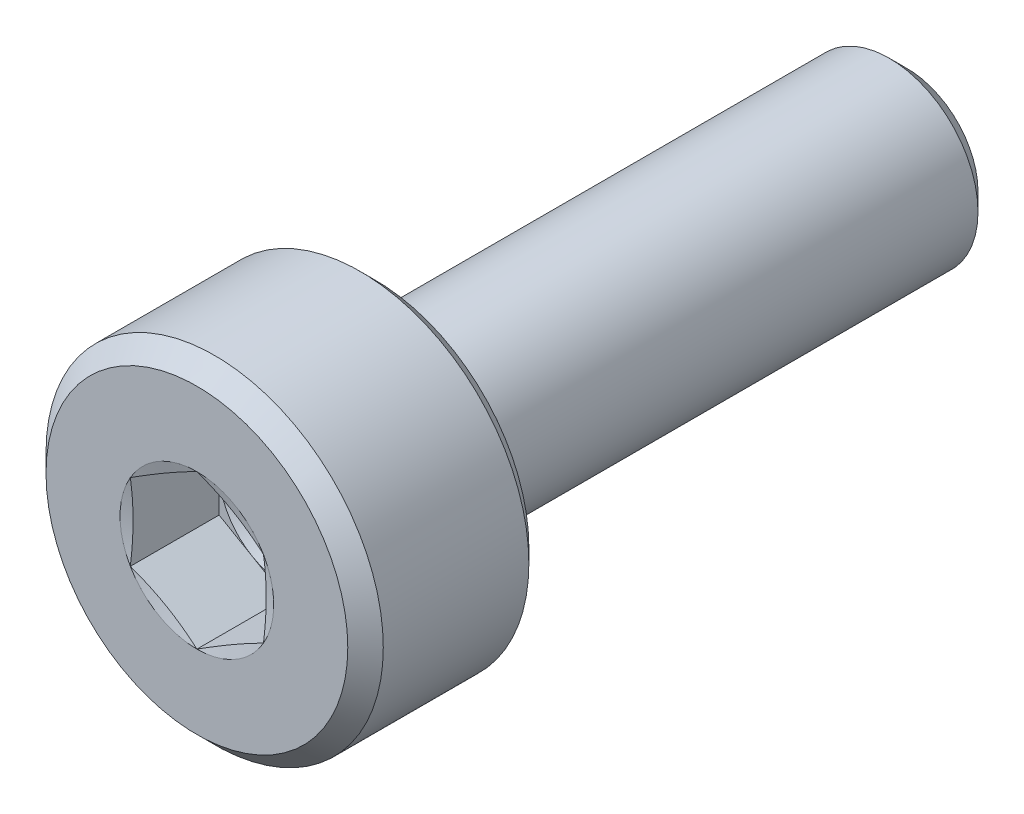
ISO-10303-21;
HEADER;
FILE_DESCRIPTION(('STEP AP214'),'2;1');
FILE_NAME('part.step','',(''),(''),'','','');
FILE_SCHEMA(('AUTOMOTIVE_DESIGN { 1 0 10303 214 1 1 1 1 }'));
ENDSEC;
DATA;
#1=APPLICATION_CONTEXT('core data for automotive mechanical design processes');
#2=APPLICATION_PROTOCOL_DEFINITION('international standard','automotive_design',2000,#1);
#3=PRODUCT_CONTEXT('',#1,'mechanical');
#4=PRODUCT('Part','Part','',(#3));
#5=PRODUCT_RELATED_PRODUCT_CATEGORY('part','',(#4));
#6=PRODUCT_DEFINITION_FORMATION('','',#4);
#7=PRODUCT_DEFINITION_CONTEXT('part definition',#1,'design');
#8=PRODUCT_DEFINITION('design','',#6,#7);
#9=PRODUCT_DEFINITION_SHAPE('','',#8);
#10=(LENGTH_UNIT() NAMED_UNIT(*) SI_UNIT(.MILLI.,.METRE.));
#11=(NAMED_UNIT(*) PLANE_ANGLE_UNIT() SI_UNIT($,.RADIAN.));
#12=(NAMED_UNIT(*) SI_UNIT($,.STERADIAN.) SOLID_ANGLE_UNIT());
#13=UNCERTAINTY_MEASURE_WITH_UNIT(LENGTH_MEASURE(1.E-05),#10,'distance_accuracy_value','');
#14=(GEOMETRIC_REPRESENTATION_CONTEXT(3) GLOBAL_UNCERTAINTY_ASSIGNED_CONTEXT((#13)) GLOBAL_UNIT_ASSIGNED_CONTEXT((#10,
#11,#12)) REPRESENTATION_CONTEXT('',''));
#15=CARTESIAN_POINT('',(0.,0.,0.));
#16=DIRECTION('',(0.,0.,1.));
#17=DIRECTION('',(1.,0.,0.));
#18=AXIS2_PLACEMENT_3D('',#15,#16,#17);
#19=CARTESIAN_POINT('',(0.,0.,0.));
#20=DIRECTION('',(0.,0.,-1.));
#21=DIRECTION('',(-1.,0.,0.));
#22=AXIS2_PLACEMENT_3D('',#19,#20,#21);
#23=PLANE('',#22);
#24=CARTESIAN_POINT('',(0.,0.,0.));
#25=DIRECTION('',(0.,0.,1.));
#26=DIRECTION('',(1.,0.,0.));
#27=AXIS2_PLACEMENT_3D('',#24,#25,#26);
#28=CIRCLE('',#27,1.7);
#29=CARTESIAN_POINT('',(1.7,0.,0.));
#30=VERTEX_POINT('',#29);
#31=EDGE_CURVE('E230',#30,#30,#28,.T.);
#32=ORIENTED_EDGE('',*,*,#31,.T.);
#33=EDGE_LOOP('',(#32));
#34=FACE_BOUND('',#33,.T.);
#35=CARTESIAN_POINT('',(0.,0.,0.));
#36=DIRECTION('',(0.,0.,1.));
#37=DIRECTION('',(1.,0.,0.));
#38=AXIS2_PLACEMENT_3D('',#35,#36,#37);
#39=CIRCLE('',#38,0.866025403784438);
#40=CARTESIAN_POINT('',(-0.75,-0.433012701892219,0.));
#41=VERTEX_POINT('',#40);
#42=CARTESIAN_POINT('',(0.,-0.866025403784438,0.));
#43=VERTEX_POINT('',#42);
#44=EDGE_CURVE('E156',#41,#43,#39,.T.);
#45=ORIENTED_EDGE('',*,*,#44,.F.);
#46=CARTESIAN_POINT('',(-0.75,0.433012701892219,0.));
#47=VERTEX_POINT('',#46);
#48=EDGE_CURVE('E155',#47,#41,#39,.T.);
#49=ORIENTED_EDGE('',*,*,#48,.F.);
#50=CARTESIAN_POINT('',(0.,0.866025403784438,0.));
#51=VERTEX_POINT('',#50);
#52=EDGE_CURVE('E122',#51,#47,#39,.T.);
#53=ORIENTED_EDGE('',*,*,#52,.F.);
#54=CARTESIAN_POINT('',(0.75,0.433012701892219,0.));
#55=VERTEX_POINT('',#54);
#56=EDGE_CURVE('E116',#55,#51,#39,.T.);
#57=ORIENTED_EDGE('',*,*,#56,.F.);
#58=CARTESIAN_POINT('',(0.749999999999999,-0.433012701892221,0.));
#59=VERTEX_POINT('',#58);
#60=EDGE_CURVE('E124',#59,#55,#39,.T.);
#61=ORIENTED_EDGE('',*,*,#60,.F.);
#62=EDGE_CURVE('E314',#43,#59,#39,.T.);
#63=ORIENTED_EDGE('',*,*,#62,.F.);
#64=EDGE_LOOP('',(#45,#49,#53,#57,#61,#63));
#65=FACE_BOUND('',#64,.T.);
#66=ADVANCED_FACE('F39',(#34,#65),#23,.F.);
#67=CARTESIAN_POINT('',(0.,0.,-0.2));
#68=DIRECTION('',(0.,0.,-1.));
#69=DIRECTION('',(-1.,0.,0.));
#70=AXIS2_PLACEMENT_3D('',#67,#68,#69);
#71=CONICAL_SURFACE('',#70,1.9,0.78539816339746);
#72=ORIENTED_EDGE('',*,*,#31,.F.);
#73=EDGE_LOOP('',(#72));
#74=FACE_BOUND('',#73,.T.);
#75=CARTESIAN_POINT('',(0.,0.,-0.2));
#76=DIRECTION('',(0.,0.,1.));
#77=DIRECTION('',(1.,0.,0.));
#78=AXIS2_PLACEMENT_3D('',#75,#76,#77);
#79=CIRCLE('',#78,1.9);
#80=CARTESIAN_POINT('',(1.9,0.,-0.2));
#81=VERTEX_POINT('',#80);
#82=EDGE_CURVE('E232',#81,#81,#79,.T.);
#83=ORIENTED_EDGE('',*,*,#82,.T.);
#84=EDGE_LOOP('',(#83));
#85=FACE_BOUND('',#84,.T.);
#86=ADVANCED_FACE('F221',(#74,#85),#71,.T.);
#87=CARTESIAN_POINT('',(0.,0.,0.));
#88=DIRECTION('',(0.,0.,1.));
#89=DIRECTION('',(1.,0.,0.));
#90=AXIS2_PLACEMENT_3D('',#87,#88,#89);
#91=CYLINDRICAL_SURFACE('',#90,1.9);
#92=ORIENTED_EDGE('',*,*,#82,.F.);
#93=EDGE_LOOP('',(#92));
#94=FACE_BOUND('',#93,.T.);
#95=CARTESIAN_POINT('',(0.,0.,-1.84));
#96=DIRECTION('',(0.,0.,1.));
#97=DIRECTION('',(1.,0.,0.));
#98=AXIS2_PLACEMENT_3D('',#95,#96,#97);
#99=CIRCLE('',#98,1.9);
#100=CARTESIAN_POINT('',(1.9,0.,-1.84));
#101=VERTEX_POINT('',#100);
#102=EDGE_CURVE('E235',#101,#101,#99,.T.);
#103=ORIENTED_EDGE('',*,*,#102,.T.);
#104=EDGE_LOOP('',(#103));
#105=FACE_BOUND('',#104,.T.);
#106=ADVANCED_FACE('F226',(#94,#105),#91,.T.);
#107=CARTESIAN_POINT('',(0.,0.,-2.));
#108=DIRECTION('',(0.,0.,1.));
#109=DIRECTION('',(1.,0.,0.));
#110=AXIS2_PLACEMENT_3D('',#107,#108,#109);
#111=CONICAL_SURFACE('',#110,1.74,0.785398163397452);
#112=ORIENTED_EDGE('',*,*,#102,.F.);
#113=EDGE_LOOP('',(#112));
#114=FACE_BOUND('',#113,.T.);
#115=CARTESIAN_POINT('',(0.,0.,-2.));
#116=DIRECTION('',(0.,0.,1.));
#117=DIRECTION('',(1.,0.,0.));
#118=AXIS2_PLACEMENT_3D('',#115,#116,#117);
#119=CIRCLE('',#118,1.74);
#120=CARTESIAN_POINT('',(1.74,0.,-2.));
#121=VERTEX_POINT('',#120);
#122=EDGE_CURVE('E240',#121,#121,#119,.T.);
#123=ORIENTED_EDGE('',*,*,#122,.T.);
#124=EDGE_LOOP('',(#123));
#125=FACE_BOUND('',#124,.T.);
#126=ADVANCED_FACE('F430',(#114,#125),#111,.T.);
#127=CARTESIAN_POINT('',(0.,1.74,-2.));
#128=DIRECTION('',(0.,0.,1.));
#129=DIRECTION('',(1.,0.,0.));
#130=AXIS2_PLACEMENT_3D('',#127,#128,#129);
#131=PLANE('',#130);
#132=ORIENTED_EDGE('',*,*,#122,.F.);
#133=EDGE_LOOP('',(#132));
#134=FACE_BOUND('',#133,.T.);
#135=CARTESIAN_POINT('',(0.,0.,-2.));
#136=DIRECTION('',(0.,0.,1.));
#137=DIRECTION('',(1.,0.,0.));
#138=AXIS2_PLACEMENT_3D('',#135,#136,#137);
#139=CIRCLE('',#138,1.3);
#140=CARTESIAN_POINT('',(1.3,0.,-2.));
#141=VERTEX_POINT('',#140);
#142=EDGE_CURVE('E243',#141,#141,#139,.T.);
#143=ORIENTED_EDGE('',*,*,#142,.T.);
#144=EDGE_LOOP('',(#143));
#145=FACE_BOUND('',#144,.T.);
#146=ADVANCED_FACE('F422',(#134,#145),#131,.F.);
#147=CARTESIAN_POINT('',(0.,0.,-2.1));
#148=DIRECTION('',(0.,0.,1.));
#149=DIRECTION('',(1.,0.,0.));
#150=AXIS2_PLACEMENT_3D('',#147,#148,#149);
#151=TOROIDAL_SURFACE('',#150,1.3,0.1);
#152=ORIENTED_EDGE('',*,*,#142,.F.);
#153=EDGE_LOOP('',(#152));
#154=FACE_BOUND('',#153,.T.);
#155=CARTESIAN_POINT('',(0.,0.,-2.05615763679786));
#156=DIRECTION('',(0.,0.,1.));
#157=DIRECTION('',(1.,0.,0.));
#158=AXIS2_PLACEMENT_3D('',#155,#156,#157);
#159=CIRCLE('',#158,1.21012315543561);
#160=CARTESIAN_POINT('',(1.21012315543561,0.,-2.05615763679786));
#161=VERTEX_POINT('',#160);
#162=EDGE_CURVE('E246',#161,#161,#159,.T.);
#163=ORIENTED_EDGE('',*,*,#162,.T.);
#164=EDGE_LOOP('',(#163));
#165=FACE_BOUND('',#164,.T.);
#166=ADVANCED_FACE('F414',(#154,#165),#151,.F.);
#167=CARTESIAN_POINT('',(0.,0.,-2.46615763679786));
#168=DIRECTION('',(0.,0.,1.));
#169=DIRECTION('',(1.,0.,0.));
#170=AXIS2_PLACEMENT_3D('',#167,#168,#169);
#171=CONICAL_SURFACE('',#170,1.01012315543561,0.453844001521509);
#172=ORIENTED_EDGE('',*,*,#162,.F.);
#173=EDGE_LOOP('',(#172));
#174=FACE_BOUND('',#173,.T.);
#175=CARTESIAN_POINT('',(0.,0.,-2.46615763679786));
#176=DIRECTION('',(0.,0.,1.));
#177=DIRECTION('',(1.,0.,0.));
#178=AXIS2_PLACEMENT_3D('',#175,#176,#177);
#179=CIRCLE('',#178,1.01012315543561);
#180=CARTESIAN_POINT('',(1.01012315543561,0.,-2.46615763679786));
#181=VERTEX_POINT('',#180);
#182=EDGE_CURVE('E249',#181,#181,#179,.T.);
#183=ORIENTED_EDGE('',*,*,#182,.T.);
#184=EDGE_LOOP('',(#183));
#185=FACE_BOUND('',#184,.T.);
#186=ADVANCED_FACE('F406',(#174,#185),#171,.T.);
#187=CARTESIAN_POINT('',(0.,0.,-2.51));
#188=DIRECTION('',(0.,0.,1.));
#189=DIRECTION('',(1.,0.,0.));
#190=AXIS2_PLACEMENT_3D('',#187,#188,#189);
#191=TOROIDAL_SURFACE('',#190,1.1,0.0999999999999999);
#192=ORIENTED_EDGE('',*,*,#182,.F.);
#193=EDGE_LOOP('',(#192));
#194=FACE_BOUND('',#193,.T.);
#195=CARTESIAN_POINT('',(0.,0.,-2.51));
#196=DIRECTION('',(0.,0.,1.));
#197=DIRECTION('',(1.,0.,0.));
#198=AXIS2_PLACEMENT_3D('',#195,#196,#197);
#199=CIRCLE('',#198,1.);
#200=CARTESIAN_POINT('',(1.,0.,-2.51));
#201=VERTEX_POINT('',#200);
#202=EDGE_CURVE('E252',#201,#201,#199,.T.);
#203=ORIENTED_EDGE('',*,*,#202,.T.);
#204=EDGE_LOOP('',(#203));
#205=FACE_BOUND('',#204,.T.);
#206=ADVANCED_FACE('F398',(#194,#205),#191,.F.);
#207=CARTESIAN_POINT('',(0.,0.,0.));
#208=DIRECTION('',(0.,0.,1.));
#209=DIRECTION('',(1.,0.,0.));
#210=AXIS2_PLACEMENT_3D('',#207,#208,#209);
#211=CYLINDRICAL_SURFACE('',#210,1.);
#212=ORIENTED_EDGE('',*,*,#202,.F.);
#213=EDGE_LOOP('',(#212));
#214=FACE_BOUND('',#213,.T.);
#215=CARTESIAN_POINT('',(0.,0.,-7.79999999999999));
#216=DIRECTION('',(0.,0.,1.));
#217=DIRECTION('',(1.,0.,0.));
#218=AXIS2_PLACEMENT_3D('',#215,#216,#217);
#219=CIRCLE('',#218,1.);
#220=CARTESIAN_POINT('',(1.,0.,-7.79999999999999));
#221=VERTEX_POINT('',#220);
#222=EDGE_CURVE('E255',#221,#221,#219,.T.);
#223=ORIENTED_EDGE('',*,*,#222,.T.);
#224=EDGE_LOOP('',(#223));
#225=FACE_BOUND('',#224,.T.);
#226=ADVANCED_FACE('F389',(#214,#225),#211,.T.);
#227=CARTESIAN_POINT('',(0.,0.,-8.));
#228=DIRECTION('',(0.,0.,1.));
#229=DIRECTION('',(1.,0.,0.));
#230=AXIS2_PLACEMENT_3D('',#227,#228,#229);
#231=CONICAL_SURFACE('',#230,0.8,0.785398163397432);
#232=ORIENTED_EDGE('',*,*,#222,.F.);
#233=EDGE_LOOP('',(#232));
#234=FACE_BOUND('',#233,.T.);
#235=CARTESIAN_POINT('',(0.,0.,-8.));
#236=DIRECTION('',(0.,0.,1.));
#237=DIRECTION('',(1.,0.,0.));
#238=AXIS2_PLACEMENT_3D('',#235,#236,#237);
#239=CIRCLE('',#238,0.8);
#240=CARTESIAN_POINT('',(0.8,0.,-8.));
#241=VERTEX_POINT('',#240);
#242=EDGE_CURVE('E258',#241,#241,#239,.T.);
#243=ORIENTED_EDGE('',*,*,#242,.T.);
#244=EDGE_LOOP('',(#243));
#245=FACE_BOUND('',#244,.T.);
#246=ADVANCED_FACE('F381',(#234,#245),#231,.T.);
#247=CARTESIAN_POINT('',(0.,0.8,-8.));
#248=DIRECTION('',(0.,0.,1.));
#249=DIRECTION('',(1.,0.,0.));
#250=AXIS2_PLACEMENT_3D('',#247,#248,#249);
#251=PLANE('',#250);
#252=ORIENTED_EDGE('',*,*,#242,.F.);
#253=EDGE_LOOP('',(#252));
#254=FACE_BOUND('',#253,.T.);
#255=ADVANCED_FACE('F375',(#254),#251,.F.);
#256=CARTESIAN_POINT('',(0.,0.,-0.0310889132455344));
#257=DIRECTION('',(0.,0.,1.));
#258=DIRECTION('',(1.,0.,0.));
#259=AXIS2_PLACEMENT_3D('',#256,#257,#258);
#260=CONICAL_SURFACE('',#259,0.75,1.30899693899575);
#261=ORIENTED_EDGE('',*,*,#52,.T.);
#262=CARTESIAN_POINT('',(-0.7502,0.432897231838381,3.09462948723988E-05));
#263=CARTESIAN_POINT('',(-0.719037840271989,0.450888713145879,-0.00479360311149042));
#264=CARTESIAN_POINT('',(-0.687819151238554,0.468912831663079,-0.00917362250903629));
#265=CARTESIAN_POINT('',(-0.625271438524168,0.505024770435926,-0.0168690566741957));
#266=CARTESIAN_POINT('',(-0.593942375178671,0.523112613591908,-0.0201840383063053));
#267=CARTESIAN_POINT('',(-0.53136401188606,0.559242248484343,-0.0255557361470388));
#268=CARTESIAN_POINT('',(-0.5001151357921,0.577283795509063,-0.0276188631563584));
#269=CARTESIAN_POINT('',(-0.437577500528089,0.613389916063223,-0.0303853199406949));
#270=CARTESIAN_POINT('',(-0.406288750264044,0.631454484450776,-0.0310889132455344));
#271=CARTESIAN_POINT('',(-0.343711249735956,0.667583621225882,-0.0310889132455345));
#272=CARTESIAN_POINT('',(-0.312422499471911,0.685648189613435,-0.0303853199406949));
#273=CARTESIAN_POINT('',(-0.2498848642079,0.721754310167594,-0.0276188631563584));
#274=CARTESIAN_POINT('',(-0.21863598811394,0.739795857192315,-0.0255557361470388));
#275=CARTESIAN_POINT('',(-0.156057624821329,0.77592549208475,-0.0201840383063053));
#276=CARTESIAN_POINT('',(-0.124728561475832,0.794013335240732,-0.0168690566741957));
#277=CARTESIAN_POINT('',(-0.0621808487614457,0.830125274013578,-0.00917362250903634));
#278=CARTESIAN_POINT('',(-0.0309621597280112,0.848149392530779,-0.00479360311149048));
#279=CARTESIAN_POINT('',(0.000200000000000003,0.866140873838276,3.09462948723373E-05));
#280=B_SPLINE_CURVE_WITH_KNOTS('',3,(#262,#263,#264,#265,#266,#267,#268,#269,#270,#271,#272,
#273,#274,#275,#276,#277,#278,#279),.UNSPECIFIED.,.F.,.F.,(4,2,2,2,2,2,2,2,4),(0.,
0.108920587259311,0.217885415043552,0.326287413293608,0.434668396966266,0.543049380638924,
0.651451378888981,0.760416206673221,0.869336793932533),.UNSPECIFIED.);
#281=EDGE_CURVE('E11',#47,#51,#280,.T.);
#282=ORIENTED_EDGE('',*,*,#281,.T.);
#283=EDGE_LOOP('',(#261,#282));
#284=FACE_BOUND('',#283,.T.);
#285=ADVANCED_FACE('F128',(#284),#260,.F.);
#286=CARTESIAN_POINT('',(-0.75,-1.14482258623613,0.13466962524668));
#287=CARTESIAN_POINT('',(-0.75,-1.07678185164575,0.11946091693451));
#288=CARTESIAN_POINT('',(-0.75,-1.00866186993933,0.104564139677019));
#289=CARTESIAN_POINT('',(-0.75,-0.872108780270127,0.0759343556155123));
#290=CARTESIAN_POINT('',(-0.75,-0.803675428468904,0.0622025196192108));
#291=CARTESIAN_POINT('',(-0.75,-0.667024328389678,0.0365778066728533));
#292=CARTESIAN_POINT('',(-0.75,-0.598809231475784,0.0246711034130511));
#293=CARTESIAN_POINT('',(-0.75,-0.461968565078349,0.00349957725576435));
#294=CARTESIAN_POINT('',(-0.75,-0.393343069174551,-0.00576570552870658));
#295=CARTESIAN_POINT('',(-0.75,-0.254874387193197,-0.0204880637590047));
#296=CARTESIAN_POINT('',(-0.75,-0.185026204144043,-0.0259009217168571));
#297=CARTESIAN_POINT('',(-0.75,-0.0451386456006473,-0.0315728233282039));
#298=CARTESIAN_POINT('',(-0.75,0.0249006157145767,-0.0318344646143007));
#299=CARTESIAN_POINT('',(-0.75,0.165046593870639,-0.0271336726580643));
#300=CARTESIAN_POINT('',(-0.75,0.235152611190908,-0.0221520199445757));
#301=CARTESIAN_POINT('',(-0.75,0.374971381665316,-0.00804964390688157));
#302=CARTESIAN_POINT('',(-0.75,0.444683810838038,0.00107409444110482));
#303=CARTESIAN_POINT('',(-0.75,0.57900664470664,0.0214252947723859));
#304=CARTESIAN_POINT('',(-0.75,0.643645711070564,0.0324706666633663));
#305=CARTESIAN_POINT('',(-0.75,0.772626203639037,0.0561976243366958));
#306=CARTESIAN_POINT('',(-0.75,0.836967591207445,0.0688794166647536));
#307=CARTESIAN_POINT('',(-0.75,0.96543538187879,0.0953387697110077));
#308=CARTESIAN_POINT('',(-0.75,1.02956173962238,0.109116548118427));
#309=CARTESIAN_POINT('',(-0.75,1.15764916486959,0.137422879220211));
#310=CARTESIAN_POINT('',(-0.75,1.22161022807931,0.151951451216337));
#311=CARTESIAN_POINT('',(-0.75,1.41205284321497,0.196019971996214));
#312=CARTESIAN_POINT('',(-0.75,1.53835925197156,0.226314183405895));
#313=CARTESIAN_POINT('',(-0.75,1.72754301618681,0.272539035787117));
#314=CARTESIAN_POINT('',(-0.75,1.79052001268668,0.28806821024875));
#315=CARTESIAN_POINT('',(-0.75,1.91641912521064,0.319338785610066));
#316=CARTESIAN_POINT('',(-0.75,1.97934124297332,0.335080179505711));
#317=CARTESIAN_POINT('',(-0.75,2.04224365999308,0.350900921516616));
#318=B_SPLINE_CURVE_WITH_KNOTS('',3,(#286,#287,#288,#289,#290,#291,#292,#293,#294,#295,#296,
#297,#298,#299,#300,#301,#302,#303,#304,#305,#306,#307,#308,#309,#310,#311,#312,#313,#314,#315,
#316,#317),.UNSPECIFIED.,.F.,.F.,(4,2,2,2,2,2,2,2,2,2,2,2,2,2,2,4),(0.,0.209172832960231,
0.418553461255022,0.626259888239563,0.833930130186138,1.04394713172849,1.25385822411851,
1.46454144122955,1.67537826112991,1.87207734374703,2.06880127765738,2.26556438371338,
2.46233255076827,2.85198678875997,3.04657695287832,3.24116071043612),.UNSPECIFIED.);
#319=EDGE_CURVE('E121',#41,#47,#318,.T.);
#320=ORIENTED_EDGE('',*,*,#319,.T.);
#321=ORIENTED_EDGE('',*,*,#48,.T.);
#322=EDGE_LOOP('',(#320,#321));
#323=FACE_BOUND('',#322,.T.);
#324=ADVANCED_FACE('F362',(#323),#260,.F.);
#325=CARTESIAN_POINT('',(0.000199999999999821,-0.866140873838277,3.0946294872561E-05));
#326=CARTESIAN_POINT('',(-0.0309621597280112,-0.84814939253078,-0.00479360311149026));
#327=CARTESIAN_POINT('',(-0.0621808487614458,-0.830125274013579,-0.00917362250903614));
#328=CARTESIAN_POINT('',(-0.124728561475833,-0.794013335240732,-0.0168690566741955));
#329=CARTESIAN_POINT('',(-0.15605762482133,-0.775925492084751,-0.0201840383063051));
#330=CARTESIAN_POINT('',(-0.218635988113941,-0.739795857192316,-0.0255557361470386));
#331=CARTESIAN_POINT('',(-0.2498848642079,-0.721754310167595,-0.0276188631563583));
#332=CARTESIAN_POINT('',(-0.312422499471911,-0.685648189613436,-0.0303853199406947));
#333=CARTESIAN_POINT('',(-0.343711249735956,-0.667583621225883,-0.0310889132455343));
#334=CARTESIAN_POINT('',(-0.406288750264045,-0.631454484450776,-0.0310889132455343));
#335=CARTESIAN_POINT('',(-0.437577500528089,-0.613389916063223,-0.0303853199406947));
#336=CARTESIAN_POINT('',(-0.5001151357921,-0.577283795509064,-0.0276188631563583));
#337=CARTESIAN_POINT('',(-0.53136401188606,-0.559242248484343,-0.0255557361470387));
#338=CARTESIAN_POINT('',(-0.593942375178671,-0.523112613591908,-0.0201840383063052));
#339=CARTESIAN_POINT('',(-0.625271438524168,-0.505024770435926,-0.0168690566741956));
#340=CARTESIAN_POINT('',(-0.687819151238555,-0.46891283166308,-0.0091736225090362));
#341=CARTESIAN_POINT('',(-0.719037840271989,-0.450888713145879,-0.00479360311149033));
#342=CARTESIAN_POINT('',(-0.7502,-0.432897231838382,3.09462948724902E-05));
#343=B_SPLINE_CURVE_WITH_KNOTS('',3,(#325,#326,#327,#328,#329,#330,#331,#332,#333,#334,#335,
#336,#337,#338,#339,#340,#341,#342),.UNSPECIFIED.,.F.,.F.,(4,2,2,2,2,2,2,2,4),(0.,
0.108920587259312,0.217885415043552,0.326287413293608,0.434668396966266,0.543049380638925,
0.651451378888981,0.760416206673221,0.869336793932533),.UNSPECIFIED.);
#344=EDGE_CURVE('E164',#43,#41,#343,.T.);
#345=ORIENTED_EDGE('',*,*,#344,.T.);
#346=ORIENTED_EDGE('',*,*,#44,.T.);
#347=EDGE_LOOP('',(#345,#346));
#348=FACE_BOUND('',#347,.T.);
#349=ADVANCED_FACE('F356',(#348),#260,.F.);
#350=CARTESIAN_POINT('',(0.7502,-0.432897231838382,3.0946294872516E-05));
#351=CARTESIAN_POINT('',(0.719037840271989,-0.45088871314588,-0.00479360311149026));
#352=CARTESIAN_POINT('',(0.687819151238554,-0.46891283166308,-0.00917362250903614));
#353=CARTESIAN_POINT('',(0.625271438524167,-0.505024770435927,-0.0168690566741955));
#354=CARTESIAN_POINT('',(0.59394237517867,-0.523112613591908,-0.0201840383063052));
#355=CARTESIAN_POINT('',(0.531364011886059,-0.559242248484343,-0.0255557361470386));
#356=CARTESIAN_POINT('',(0.5001151357921,-0.577283795509064,-0.0276188631563582));
#357=CARTESIAN_POINT('',(0.437577500528089,-0.613389916063224,-0.0303853199406947));
#358=CARTESIAN_POINT('',(0.406288750264044,-0.631454484450777,-0.0310889132455343));
#359=CARTESIAN_POINT('',(0.343711249735955,-0.667583621225883,-0.0310889132455343));
#360=CARTESIAN_POINT('',(0.312422499471911,-0.685648189613436,-0.0303853199406947));
#361=CARTESIAN_POINT('',(0.2498848642079,-0.721754310167595,-0.0276188631563582));
#362=CARTESIAN_POINT('',(0.21863598811394,-0.739795857192316,-0.0255557361470386));
#363=CARTESIAN_POINT('',(0.156057624821329,-0.775925492084751,-0.0201840383063051));
#364=CARTESIAN_POINT('',(0.124728561475832,-0.794013335240733,-0.0168690566741955));
#365=CARTESIAN_POINT('',(0.0621808487614455,-0.830125274013579,-0.00917362250903611));
#366=CARTESIAN_POINT('',(0.0309621597280109,-0.84814939253078,-0.00479360311149025));
#367=CARTESIAN_POINT('',(-0.000200000000000211,-0.866140873838277,3.09462948725669E-05));
#368=B_SPLINE_CURVE_WITH_KNOTS('',3,(#350,#351,#352,#353,#354,#355,#356,#357,#358,#359,#360,
#361,#362,#363,#364,#365,#366,#367),.UNSPECIFIED.,.F.,.F.,(4,2,2,2,2,2,2,2,4),(0.,
0.108920587259312,0.217885415043551,0.326287413293608,0.434668396966266,0.543049380638924,
0.651451378888981,0.760416206673221,0.869336793932533),.UNSPECIFIED.);
#369=EDGE_CURVE('E184',#59,#43,#368,.T.);
#370=ORIENTED_EDGE('',*,*,#369,.T.);
#371=ORIENTED_EDGE('',*,*,#62,.T.);
#372=EDGE_LOOP('',(#370,#371));
#373=FACE_BOUND('',#372,.T.);
#374=ADVANCED_FACE('F350',(#373),#260,.F.);
#375=CARTESIAN_POINT('',(0.75,-1.14482258623613,0.13466962524668));
#376=CARTESIAN_POINT('',(0.75,-1.07678185164575,0.11946091693451));
#377=CARTESIAN_POINT('',(0.75,-1.00866186993933,0.104564139677019));
#378=CARTESIAN_POINT('',(0.75,-0.872108780270127,0.0759343556155123));
#379=CARTESIAN_POINT('',(0.75,-0.803675428468904,0.0622025196192108));
#380=CARTESIAN_POINT('',(0.75,-0.667024328389678,0.0365778066728533));
#381=CARTESIAN_POINT('',(0.75,-0.598809231475784,0.0246711034130512));
#382=CARTESIAN_POINT('',(0.75,-0.461968565078349,0.00349957725576444));
#383=CARTESIAN_POINT('',(0.75,-0.393343069174551,-0.00576570552870653));
#384=CARTESIAN_POINT('',(0.75,-0.254874387193197,-0.0204880637590047));
#385=CARTESIAN_POINT('',(0.75,-0.185026204144043,-0.025900921716857));
#386=CARTESIAN_POINT('',(0.75,-0.045138645600648,-0.0315728233282039));
#387=CARTESIAN_POINT('',(0.75,0.0249006157145759,-0.0318344646143007));
#388=CARTESIAN_POINT('',(0.75,0.165046593870639,-0.0271336726580643));
#389=CARTESIAN_POINT('',(0.75,0.235152611190908,-0.0221520199445758));
#390=CARTESIAN_POINT('',(0.75,0.374971381665316,-0.00804964390688162));
#391=CARTESIAN_POINT('',(0.75,0.444683810838037,0.00107409444110477));
#392=CARTESIAN_POINT('',(0.75,0.57900664470664,0.0214252947723859));
#393=CARTESIAN_POINT('',(0.75,0.643645711070564,0.0324706666633663));
#394=CARTESIAN_POINT('',(0.75,0.772626203639037,0.0561976243366958));
#395=CARTESIAN_POINT('',(0.75,0.836967591207445,0.0688794166647536));
#396=CARTESIAN_POINT('',(0.75,0.965435381878789,0.0953387697110076));
#397=CARTESIAN_POINT('',(0.75,1.02956173962238,0.109116548118427));
#398=CARTESIAN_POINT('',(0.75,1.15764916486959,0.137422879220212));
#399=CARTESIAN_POINT('',(0.75,1.22161022807931,0.151951451216337));
#400=CARTESIAN_POINT('',(0.75,1.41205284321498,0.196019971996214));
#401=CARTESIAN_POINT('',(0.75,1.53835925197156,0.226314183405895));
#402=CARTESIAN_POINT('',(0.75,1.72754301618681,0.272539035787117));
#403=CARTESIAN_POINT('',(0.75,1.79052001268668,0.28806821024875));
#404=CARTESIAN_POINT('',(0.75,1.91641912521064,0.319338785610067));
#405=CARTESIAN_POINT('',(0.75,1.97934124297332,0.335080179505711));
#406=CARTESIAN_POINT('',(0.75,2.04224365999308,0.350900921516616));
#407=B_SPLINE_CURVE_WITH_KNOTS('',3,(#375,#376,#377,#378,#379,#380,#381,#382,#383,#384,#385,
#386,#387,#388,#389,#390,#391,#392,#393,#394,#395,#396,#397,#398,#399,#400,#401,#402,#403,#404,
#405,#406),.UNSPECIFIED.,.F.,.F.,(4,2,2,2,2,2,2,2,2,2,2,2,2,2,2,4),(0.,0.209172832960231,
0.418553461255022,0.626259888239563,0.833930130186138,1.04394713172849,1.25385822411851,
1.46454144122955,1.67537826112991,1.87207734374703,2.06880127765738,2.26556438371338,
2.46233255076827,2.85198678875997,3.04657695287832,3.24116071043612),.UNSPECIFIED.);
#408=EDGE_CURVE('E64',#55,#59,#407,.F.);
#409=ORIENTED_EDGE('',*,*,#408,.T.);
#410=ORIENTED_EDGE('',*,*,#60,.T.);
#411=EDGE_LOOP('',(#409,#410));
#412=FACE_BOUND('',#411,.T.);
#413=ADVANCED_FACE('F177',(#412),#260,.F.);
#414=CARTESIAN_POINT('',(-0.000199999999999916,0.866140873838276,3.094629487239E-05));
#415=CARTESIAN_POINT('',(0.0309621597280112,0.848149392530779,-0.00479360311149047));
#416=CARTESIAN_POINT('',(0.0621808487614458,0.830125274013578,-0.00917362250903634));
#417=CARTESIAN_POINT('',(0.124728561475833,0.794013335240732,-0.0168690566741957));
#418=CARTESIAN_POINT('',(0.15605762482133,0.77592549208475,-0.0201840383063053));
#419=CARTESIAN_POINT('',(0.218635988113941,0.739795857192315,-0.0255557361470388));
#420=CARTESIAN_POINT('',(0.2498848642079,0.721754310167594,-0.0276188631563584));
#421=CARTESIAN_POINT('',(0.312422499471911,0.685648189613435,-0.0303853199406949));
#422=CARTESIAN_POINT('',(0.343711249735956,0.667583621225882,-0.0310889132455344));
#423=CARTESIAN_POINT('',(0.406288750264045,0.631454484450776,-0.0310889132455344));
#424=CARTESIAN_POINT('',(0.437577500528089,0.613389916063223,-0.0303853199406949));
#425=CARTESIAN_POINT('',(0.5001151357921,0.577283795509063,-0.0276188631563584));
#426=CARTESIAN_POINT('',(0.53136401188606,0.559242248484342,-0.0255557361470388));
#427=CARTESIAN_POINT('',(0.593942375178671,0.523112613591907,-0.0201840383063053));
#428=CARTESIAN_POINT('',(0.625271438524168,0.505024770435926,-0.0168690566741956));
#429=CARTESIAN_POINT('',(0.687819151238555,0.468912831663079,-0.00917362250903628));
#430=CARTESIAN_POINT('',(0.719037840271989,0.450888713145878,-0.00479360311149041));
#431=CARTESIAN_POINT('',(0.7502,0.432897231838381,3.09462948724049E-05));
#432=B_SPLINE_CURVE_WITH_KNOTS('',3,(#414,#415,#416,#417,#418,#419,#420,#421,#422,#423,#424,
#425,#426,#427,#428,#429,#430,#431),.UNSPECIFIED.,.F.,.F.,(4,2,2,2,2,2,2,2,4),(0.,
0.108920587259312,0.217885415043552,0.326287413293608,0.434668396966266,0.543049380638924,
0.651451378888981,0.760416206673221,0.869336793932533),.UNSPECIFIED.);
#433=EDGE_CURVE('E58',#51,#55,#432,.T.);
#434=ORIENTED_EDGE('',*,*,#433,.T.);
#435=ORIENTED_EDGE('',*,*,#56,.T.);
#436=EDGE_LOOP('',(#434,#435));
#437=FACE_BOUND('',#436,.T.);
#438=ADVANCED_FACE('F117',(#437),#260,.F.);
#439=CARTESIAN_POINT('',(0.,0.,-1.43301270189222));
#440=DIRECTION('',(0.,0.,1.));
#441=DIRECTION('',(1.,0.,0.));
#442=AXIS2_PLACEMENT_3D('',#439,#440,#441);
#443=CONICAL_SURFACE('',#442,0.,1.0471975511966);
#444=CARTESIAN_POINT('',(0.,0.,-1.));
#445=DIRECTION('',(0.,0.,1.));
#446=DIRECTION('',(1.,0.,0.));
#447=AXIS2_PLACEMENT_3D('',#444,#445,#446);
#448=CIRCLE('',#447,0.75);
#449=CARTESIAN_POINT('',(0.75,0.,-1.));
#450=VERTEX_POINT('',#449);
#451=CARTESIAN_POINT('',(0.375,0.649519052838329,-1.));
#452=VERTEX_POINT('',#451);
#453=EDGE_CURVE('E144',#450,#452,#448,.T.);
#454=ORIENTED_EDGE('',*,*,#453,.T.);
#455=CARTESIAN_POINT('',(-0.375,0.649519052838329,-1.));
#456=VERTEX_POINT('',#455);
#457=EDGE_CURVE('E52',#452,#456,#448,.T.);
#458=ORIENTED_EDGE('',*,*,#457,.T.);
#459=CARTESIAN_POINT('',(-0.75,0.,-1.));
#460=VERTEX_POINT('',#459);
#461=EDGE_CURVE('E295',#456,#460,#448,.T.);
#462=ORIENTED_EDGE('',*,*,#461,.T.);
#463=CARTESIAN_POINT('',(-0.375,-0.649519052838329,-1.));
#464=VERTEX_POINT('',#463);
#465=EDGE_CURVE('E297',#460,#464,#448,.T.);
#466=ORIENTED_EDGE('',*,*,#465,.T.);
#467=CARTESIAN_POINT('',(0.375,-0.649519052838329,-1.));
#468=VERTEX_POINT('',#467);
#469=EDGE_CURVE('E233',#464,#468,#448,.T.);
#470=ORIENTED_EDGE('',*,*,#469,.T.);
#471=EDGE_CURVE('E231',#468,#450,#448,.T.);
#472=ORIENTED_EDGE('',*,*,#471,.T.);
#473=EDGE_LOOP('',(#454,#458,#462,#466,#470,#472));
#474=FACE_BOUND('',#473,.T.);
#475=CARTESIAN_POINT('',(0.,0.,-1.43301270189222));
#476=VERTEX_POINT('',#475);
#477=VERTEX_LOOP('',#476);
#478=FACE_BOUND('',#477,.T.);
#479=ADVANCED_FACE('F176',(#474,#478),#443,.F.);
#480=CARTESIAN_POINT('',(0.,0.,-1.));
#481=DIRECTION('',(0.,0.,1.));
#482=DIRECTION('',(1.,0.,0.));
#483=AXIS2_PLACEMENT_3D('',#480,#481,#482);
#484=PLANE('',#483);
#485=ORIENTED_EDGE('',*,*,#453,.F.);
#486=DIRECTION('',(0.,1.,0.));
#487=VECTOR('',#486,1.);
#488=CARTESIAN_POINT('',(0.75,-0.43301270189222,-1.));
#489=LINE('',#488,#487);
#490=CARTESIAN_POINT('',(0.75,0.433012701892219,-1.));
#491=VERTEX_POINT('',#490);
#492=EDGE_CURVE('E274',#450,#491,#489,.T.);
#493=ORIENTED_EDGE('',*,*,#492,.T.);
#494=DIRECTION('',(-0.866025403784439,0.5,0.));
#495=VECTOR('',#494,1.);
#496=CARTESIAN_POINT('',(0.75,0.433012701892219,-1.));
#497=LINE('',#496,#495);
#498=EDGE_CURVE('E289',#491,#452,#497,.T.);
#499=ORIENTED_EDGE('',*,*,#498,.T.);
#500=EDGE_LOOP('',(#485,#493,#499));
#501=FACE_BOUND('',#500,.T.);
#502=ADVANCED_FACE('F319',(#501),#484,.T.);
#503=ORIENTED_EDGE('',*,*,#471,.F.);
#504=DIRECTION('',(0.866025403784439,0.5,0.));
#505=VECTOR('',#504,1.);
#506=CARTESIAN_POINT('',(0.,-0.866025403784439,-1.));
#507=LINE('',#506,#505);
#508=CARTESIAN_POINT('',(0.75,-0.43301270189222,-1.));
#509=VERTEX_POINT('',#508);
#510=EDGE_CURVE('E278',#468,#509,#507,.T.);
#511=ORIENTED_EDGE('',*,*,#510,.T.);
#512=EDGE_CURVE('E151',#509,#450,#489,.T.);
#513=ORIENTED_EDGE('',*,*,#512,.T.);
#514=EDGE_LOOP('',(#503,#511,#513));
#515=FACE_BOUND('',#514,.T.);
#516=ADVANCED_FACE('F207',(#515),#484,.T.);
#517=ORIENTED_EDGE('',*,*,#469,.F.);
#518=DIRECTION('',(0.866025403784438,-0.5,0.));
#519=VECTOR('',#518,1.);
#520=CARTESIAN_POINT('',(-0.75,-0.43301270189222,-1.));
#521=LINE('',#520,#519);
#522=CARTESIAN_POINT('',(0.,-0.866025403784439,-1.));
#523=VERTEX_POINT('',#522);
#524=EDGE_CURVE('E282',#464,#523,#521,.T.);
#525=ORIENTED_EDGE('',*,*,#524,.T.);
#526=EDGE_CURVE('E275',#523,#468,#507,.T.);
#527=ORIENTED_EDGE('',*,*,#526,.T.);
#528=EDGE_LOOP('',(#517,#525,#527));
#529=FACE_BOUND('',#528,.T.);
#530=ADVANCED_FACE('F310',(#529),#484,.T.);
#531=ORIENTED_EDGE('',*,*,#465,.F.);
#532=DIRECTION('',(0.,-1.,0.));
#533=VECTOR('',#532,1.);
#534=CARTESIAN_POINT('',(-0.75,0.433012701892219,-1.));
#535=LINE('',#534,#533);
#536=CARTESIAN_POINT('',(-0.75,-0.43301270189222,-1.));
#537=VERTEX_POINT('',#536);
#538=EDGE_CURVE('E286',#460,#537,#535,.T.);
#539=ORIENTED_EDGE('',*,*,#538,.T.);
#540=EDGE_CURVE('E279',#537,#464,#521,.T.);
#541=ORIENTED_EDGE('',*,*,#540,.T.);
#542=EDGE_LOOP('',(#531,#539,#541));
#543=FACE_BOUND('',#542,.T.);
#544=ADVANCED_FACE('F324',(#543),#484,.T.);
#545=ORIENTED_EDGE('',*,*,#457,.F.);
#546=CARTESIAN_POINT('',(0.,0.866025403784438,-1.));
#547=VERTEX_POINT('',#546);
#548=EDGE_CURVE('E291',#452,#547,#497,.T.);
#549=ORIENTED_EDGE('',*,*,#548,.T.);
#550=DIRECTION('',(-0.866025403784439,-0.5,0.));
#551=VECTOR('',#550,1.);
#552=CARTESIAN_POINT('',(0.,0.866025403784438,-1.));
#553=LINE('',#552,#551);
#554=EDGE_CURVE('E149',#547,#456,#553,.T.);
#555=ORIENTED_EDGE('',*,*,#554,.T.);
#556=EDGE_LOOP('',(#545,#549,#555));
#557=FACE_BOUND('',#556,.T.);
#558=ADVANCED_FACE('F321',(#557),#484,.T.);
#559=ORIENTED_EDGE('',*,*,#461,.F.);
#560=CARTESIAN_POINT('',(-0.75,0.433012701892219,-1.));
#561=VERTEX_POINT('',#560);
#562=EDGE_CURVE('E288',#456,#561,#553,.T.);
#563=ORIENTED_EDGE('',*,*,#562,.T.);
#564=EDGE_CURVE('E283',#561,#460,#535,.T.);
#565=ORIENTED_EDGE('',*,*,#564,.T.);
#566=EDGE_LOOP('',(#559,#563,#565));
#567=FACE_BOUND('',#566,.T.);
#568=ADVANCED_FACE('F323',(#567),#484,.T.);
#569=CARTESIAN_POINT('',(0.,0.866025403784438,-1.));
#570=DIRECTION('',(-0.5,0.866025403784439,0.));
#571=DIRECTION('',(-0.866025403784439,-0.5,0.));
#572=AXIS2_PLACEMENT_3D('',#569,#570,#571);
#573=PLANE('',#572);
#574=ORIENTED_EDGE('',*,*,#281,.F.);
#575=DIRECTION('',(0.,0.,1.));
#576=VECTOR('',#575,1.);
#577=CARTESIAN_POINT('',(-0.75,0.433012701892219,-1.));
#578=LINE('',#577,#576);
#579=EDGE_CURVE('E150',#561,#47,#578,.T.);
#580=ORIENTED_EDGE('',*,*,#579,.F.);
#581=ORIENTED_EDGE('',*,*,#562,.F.);
#582=ORIENTED_EDGE('',*,*,#554,.F.);
#583=DIRECTION('',(0.,0.,1.));
#584=VECTOR('',#583,1.);
#585=CARTESIAN_POINT('',(0.,0.866025403784438,-1.));
#586=LINE('',#585,#584);
#587=EDGE_CURVE('E139',#547,#51,#586,.T.);
#588=ORIENTED_EDGE('',*,*,#587,.T.);
#589=EDGE_LOOP('',(#574,#580,#581,#582,#588));
#590=FACE_BOUND('',#589,.T.);
#591=ADVANCED_FACE('F146',(#590),#573,.F.);
#592=CARTESIAN_POINT('',(-0.75,0.433012701892219,-1.));
#593=DIRECTION('',(-1.,0.,0.));
#594=DIRECTION('',(0.,0.,1.));
#595=AXIS2_PLACEMENT_3D('',#592,#593,#594);
#596=PLANE('',#595);
#597=ORIENTED_EDGE('',*,*,#319,.F.);
#598=DIRECTION('',(0.,0.,1.));
#599=VECTOR('',#598,1.);
#600=CARTESIAN_POINT('',(-0.75,-0.43301270189222,-1.));
#601=LINE('',#600,#599);
#602=EDGE_CURVE('E262',#537,#41,#601,.T.);
#603=ORIENTED_EDGE('',*,*,#602,.F.);
#604=ORIENTED_EDGE('',*,*,#538,.F.);
#605=ORIENTED_EDGE('',*,*,#564,.F.);
#606=ORIENTED_EDGE('',*,*,#579,.T.);
#607=EDGE_LOOP('',(#597,#603,#604,#605,#606));
#608=FACE_BOUND('',#607,.T.);
#609=ADVANCED_FACE('F171',(#608),#596,.F.);
#610=CARTESIAN_POINT('',(-0.75,-0.43301270189222,-1.));
#611=DIRECTION('',(-0.5,-0.866025403784439,0.));
#612=DIRECTION('',(0.866025403784438,-0.5,0.));
#613=AXIS2_PLACEMENT_3D('',#610,#611,#612);
#614=PLANE('',#613);
#615=ORIENTED_EDGE('',*,*,#344,.F.);
#616=DIRECTION('',(0.,0.,1.));
#617=VECTOR('',#616,1.);
#618=CARTESIAN_POINT('',(0.,-0.866025403784439,-1.));
#619=LINE('',#618,#617);
#620=EDGE_CURVE('E265',#523,#43,#619,.T.);
#621=ORIENTED_EDGE('',*,*,#620,.F.);
#622=ORIENTED_EDGE('',*,*,#524,.F.);
#623=ORIENTED_EDGE('',*,*,#540,.F.);
#624=ORIENTED_EDGE('',*,*,#602,.T.);
#625=EDGE_LOOP('',(#615,#621,#622,#623,#624));
#626=FACE_BOUND('',#625,.T.);
#627=ADVANCED_FACE('F210',(#626),#614,.F.);
#628=CARTESIAN_POINT('',(0.,-0.866025403784439,-1.));
#629=DIRECTION('',(0.5,-0.866025403784439,0.));
#630=DIRECTION('',(0.866025403784439,0.5,0.));
#631=AXIS2_PLACEMENT_3D('',#628,#629,#630);
#632=PLANE('',#631);
#633=ORIENTED_EDGE('',*,*,#369,.F.);
#634=DIRECTION('',(0.,0.,1.));
#635=VECTOR('',#634,1.);
#636=CARTESIAN_POINT('',(0.75,-0.43301270189222,-1.));
#637=LINE('',#636,#635);
#638=EDGE_CURVE('E268',#509,#59,#637,.T.);
#639=ORIENTED_EDGE('',*,*,#638,.F.);
#640=ORIENTED_EDGE('',*,*,#510,.F.);
#641=ORIENTED_EDGE('',*,*,#526,.F.);
#642=ORIENTED_EDGE('',*,*,#620,.T.);
#643=EDGE_LOOP('',(#633,#639,#640,#641,#642));
#644=FACE_BOUND('',#643,.T.);
#645=ADVANCED_FACE('F205',(#644),#632,.F.);
#646=CARTESIAN_POINT('',(0.75,-0.43301270189222,-1.));
#647=DIRECTION('',(1.,0.,0.));
#648=DIRECTION('',(0.,1.,0.));
#649=AXIS2_PLACEMENT_3D('',#646,#647,#648);
#650=PLANE('',#649);
#651=ORIENTED_EDGE('',*,*,#408,.F.);
#652=DIRECTION('',(0.,0.,1.));
#653=VECTOR('',#652,1.);
#654=CARTESIAN_POINT('',(0.75,0.433012701892219,-1.));
#655=LINE('',#654,#653);
#656=EDGE_CURVE('E143',#491,#55,#655,.T.);
#657=ORIENTED_EDGE('',*,*,#656,.F.);
#658=ORIENTED_EDGE('',*,*,#492,.F.);
#659=ORIENTED_EDGE('',*,*,#512,.F.);
#660=ORIENTED_EDGE('',*,*,#638,.T.);
#661=EDGE_LOOP('',(#651,#657,#658,#659,#660));
#662=FACE_BOUND('',#661,.T.);
#663=ADVANCED_FACE('F202',(#662),#650,.F.);
#664=CARTESIAN_POINT('',(0.75,0.433012701892219,-1.));
#665=DIRECTION('',(0.5,0.866025403784439,0.));
#666=DIRECTION('',(-0.866025403784439,0.5,0.));
#667=AXIS2_PLACEMENT_3D('',#664,#665,#666);
#668=PLANE('',#667);
#669=ORIENTED_EDGE('',*,*,#433,.F.);
#670=ORIENTED_EDGE('',*,*,#587,.F.);
#671=ORIENTED_EDGE('',*,*,#548,.F.);
#672=ORIENTED_EDGE('',*,*,#498,.F.);
#673=ORIENTED_EDGE('',*,*,#656,.T.);
#674=EDGE_LOOP('',(#669,#670,#671,#672,#673));
#675=FACE_BOUND('',#674,.T.);
#676=ADVANCED_FACE('F137',(#675),#668,.F.);
#677=CLOSED_SHELL('',(#66,#86,#106,#126,#146,#166,#186,#206,#226,#246,#255,#285,#324,#349,#374,
#413,#438,#479,#502,#516,#530,#544,#558,#568,#591,#609,#627,#645,#663,#676));
#678=MANIFOLD_SOLID_BREP('B2',#677);
#679=ADVANCED_BREP_SHAPE_REPRESENTATION('',(#18,#678),#14);
#680=SHAPE_DEFINITION_REPRESENTATION(#9,#679);
ENDSEC;
END-ISO-10303-21;
